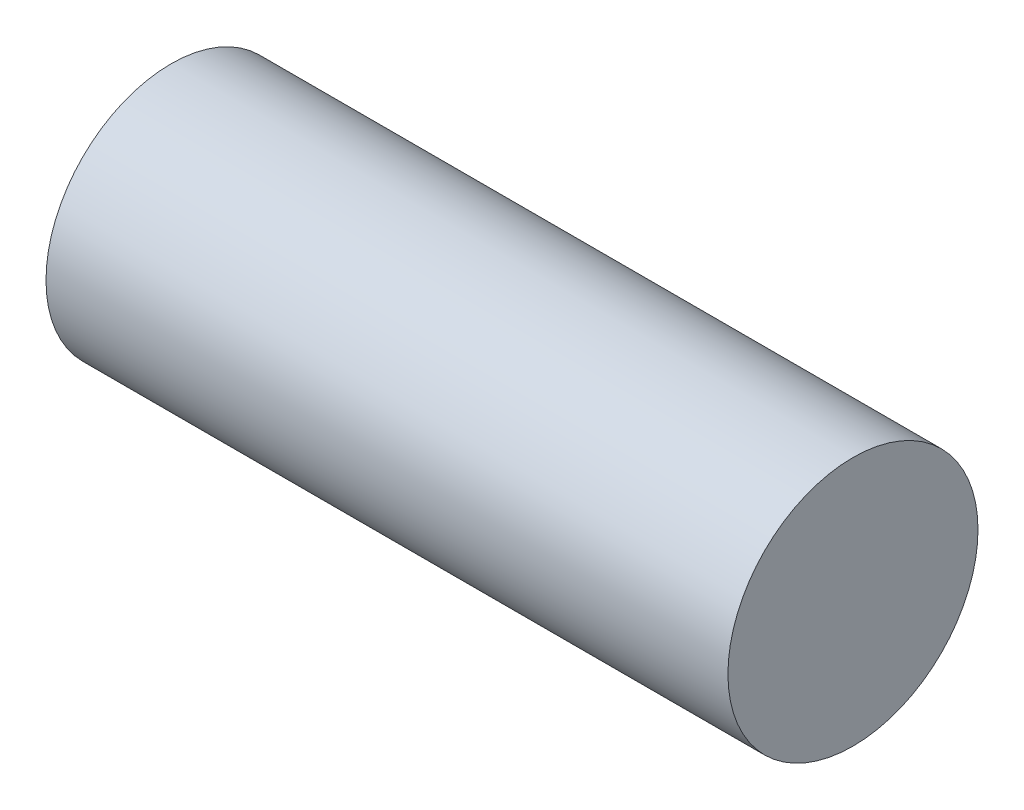
ISO-10303-21;
HEADER;
FILE_DESCRIPTION(('STEP AP214'),'2;1');
FILE_NAME('part.step','',(''),(''),'','','');
FILE_SCHEMA(('AUTOMOTIVE_DESIGN { 1 0 10303 214 1 1 1 1 }'));
ENDSEC;
DATA;
#1=APPLICATION_CONTEXT('core data for automotive mechanical design processes');
#2=APPLICATION_PROTOCOL_DEFINITION('international standard','automotive_design',2000,#1);
#3=PRODUCT_CONTEXT('',#1,'mechanical');
#4=PRODUCT('Part','Part','',(#3));
#5=PRODUCT_RELATED_PRODUCT_CATEGORY('part','',(#4));
#6=PRODUCT_DEFINITION_FORMATION('','',#4);
#7=PRODUCT_DEFINITION_CONTEXT('part definition',#1,'design');
#8=PRODUCT_DEFINITION('design','',#6,#7);
#9=PRODUCT_DEFINITION_SHAPE('','',#8);
#10=(LENGTH_UNIT() NAMED_UNIT(*) SI_UNIT(.MILLI.,.METRE.));
#11=(NAMED_UNIT(*) PLANE_ANGLE_UNIT() SI_UNIT($,.RADIAN.));
#12=(NAMED_UNIT(*) SI_UNIT($,.STERADIAN.) SOLID_ANGLE_UNIT());
#13=UNCERTAINTY_MEASURE_WITH_UNIT(LENGTH_MEASURE(1.E-05),#10,'distance_accuracy_value','');
#14=(GEOMETRIC_REPRESENTATION_CONTEXT(3) GLOBAL_UNCERTAINTY_ASSIGNED_CONTEXT((#13)) GLOBAL_UNIT_ASSIGNED_CONTEXT((#10,
#11,#12)) REPRESENTATION_CONTEXT('',''));
#15=CARTESIAN_POINT('',(0.,0.,0.));
#16=DIRECTION('',(0.,0.,1.));
#17=DIRECTION('',(1.,0.,0.));
#18=AXIS2_PLACEMENT_3D('',#15,#16,#17);
#19=CARTESIAN_POINT('',(210.,0.,0.));
#20=DIRECTION('',(-1.,0.,0.));
#21=DIRECTION('',(0.,0.,1.));
#22=AXIS2_PLACEMENT_3D('',#19,#20,#21);
#23=CYLINDRICAL_SURFACE('',#22,38.1);
#24=CARTESIAN_POINT('',(2.1999999999967,0.,0.));
#25=DIRECTION('',(1.,0.,0.));
#26=DIRECTION('',(0.,1.,0.));
#27=AXIS2_PLACEMENT_3D('',#24,#25,#26);
#28=CIRCLE('',#27,38.1);
#29=CARTESIAN_POINT('',(2.19999999999671,38.1,0.));
#30=VERTEX_POINT('',#29);
#31=EDGE_CURVE('E39',#30,#30,#28,.F.);
#32=ORIENTED_EDGE('',*,*,#31,.F.);
#33=EDGE_LOOP('',(#32));
#34=FACE_BOUND('',#33,.T.);
#35=CARTESIAN_POINT('',(210.,0.,0.));
#36=DIRECTION('',(1.,0.,0.));
#37=DIRECTION('',(0.,0.,-1.));
#38=AXIS2_PLACEMENT_3D('',#35,#36,#37);
#39=CIRCLE('',#38,38.1);
#40=CARTESIAN_POINT('',(210.,0.,-38.1));
#41=VERTEX_POINT('',#40);
#42=EDGE_CURVE('E10',#41,#41,#39,.T.);
#43=ORIENTED_EDGE('',*,*,#42,.F.);
#44=EDGE_LOOP('',(#43));
#45=FACE_BOUND('',#44,.T.);
#46=ADVANCED_FACE('F33',(#34,#45),#23,.T.);
#47=CARTESIAN_POINT('',(210.,0.,0.));
#48=DIRECTION('',(1.,0.,0.));
#49=DIRECTION('',(0.,0.,-1.));
#50=AXIS2_PLACEMENT_3D('',#47,#48,#49);
#51=PLANE('',#50);
#52=ORIENTED_EDGE('',*,*,#42,.T.);
#53=EDGE_LOOP('',(#52));
#54=FACE_BOUND('',#53,.T.);
#55=ADVANCED_FACE('F49',(#54),#51,.T.);
#56=CARTESIAN_POINT('',(2.19999999999666,-111.131742764667,-151.440228043644));
#57=DIRECTION('',(1.,0.,0.));
#58=DIRECTION('',(0.,0.558749968555413,-0.829336163831847));
#59=AXIS2_PLACEMENT_3D('',#56,#57,#58);
#60=PLANE('',#59);
#61=ORIENTED_EDGE('',*,*,#31,.T.);
#62=EDGE_LOOP('',(#61));
#63=FACE_BOUND('',#62,.T.);
#64=ADVANCED_FACE('F45',(#63),#60,.F.);
#65=CLOSED_SHELL('',(#46,#55,#64));
#66=MANIFOLD_SOLID_BREP('B2',#65);
#67=ADVANCED_BREP_SHAPE_REPRESENTATION('',(#18,#66),#14);
#68=SHAPE_DEFINITION_REPRESENTATION(#9,#67);
ENDSEC;
END-ISO-10303-21;
